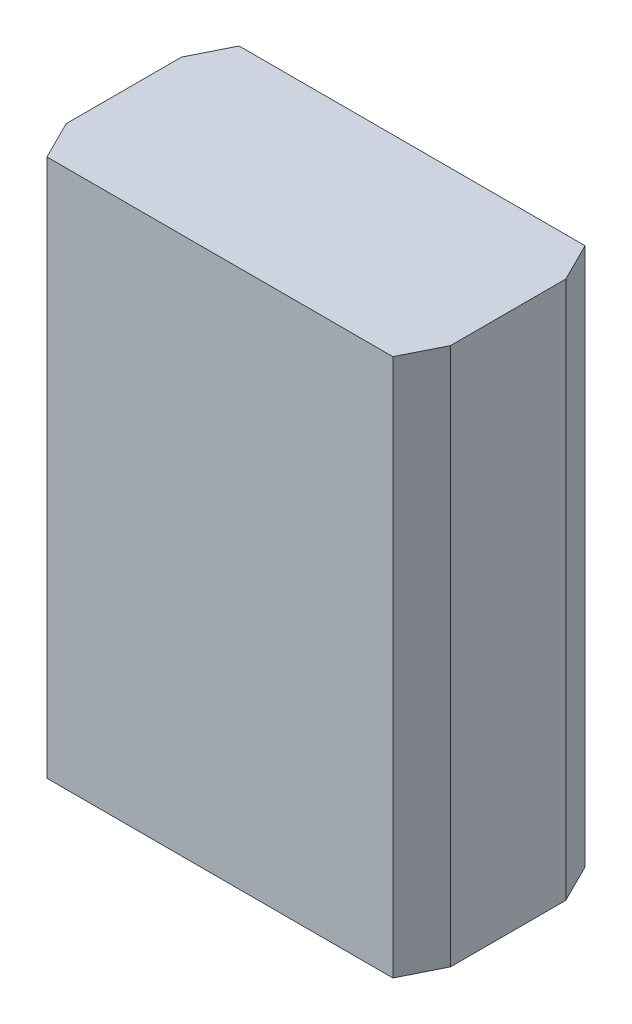
ISO-10303-21;
HEADER;
FILE_DESCRIPTION(('STEP AP214'),'2;1');
FILE_NAME('part.step','',(''),(''),'','','');
FILE_SCHEMA(('AUTOMOTIVE_DESIGN { 1 0 10303 214 1 1 1 1 }'));
ENDSEC;
DATA;
#1=APPLICATION_CONTEXT('core data for automotive mechanical design processes');
#2=APPLICATION_PROTOCOL_DEFINITION('international standard','automotive_design',2000,#1);
#3=PRODUCT_CONTEXT('',#1,'mechanical');
#4=PRODUCT('Part','Part','',(#3));
#5=PRODUCT_RELATED_PRODUCT_CATEGORY('part','',(#4));
#6=PRODUCT_DEFINITION_FORMATION('','',#4);
#7=PRODUCT_DEFINITION_CONTEXT('part definition',#1,'design');
#8=PRODUCT_DEFINITION('design','',#6,#7);
#9=PRODUCT_DEFINITION_SHAPE('','',#8);
#10=(LENGTH_UNIT() NAMED_UNIT(*) SI_UNIT(.MILLI.,.METRE.));
#11=(NAMED_UNIT(*) PLANE_ANGLE_UNIT() SI_UNIT($,.RADIAN.));
#12=(NAMED_UNIT(*) SI_UNIT($,.STERADIAN.) SOLID_ANGLE_UNIT());
#13=UNCERTAINTY_MEASURE_WITH_UNIT(LENGTH_MEASURE(1.E-05),#10,'distance_accuracy_value','');
#14=(GEOMETRIC_REPRESENTATION_CONTEXT(3) GLOBAL_UNCERTAINTY_ASSIGNED_CONTEXT((#13)) GLOBAL_UNIT_ASSIGNED_CONTEXT((#10,
#11,#12)) REPRESENTATION_CONTEXT('',''));
#15=CARTESIAN_POINT('',(0.,0.,0.));
#16=DIRECTION('',(0.,0.,1.));
#17=DIRECTION('',(1.,0.,0.));
#18=AXIS2_PLACEMENT_3D('',#15,#16,#17);
#19=CARTESIAN_POINT('',(0.,0.,0.));
#20=DIRECTION('',(0.,-1.,0.));
#21=DIRECTION('',(0.,0.,-1.));
#22=AXIS2_PLACEMENT_3D('',#19,#20,#21);
#23=PLANE('',#22);
#24=DIRECTION('',(0.,0.,1.));
#25=VECTOR('',#24,1.);
#26=CARTESIAN_POINT('',(-0.95,0.,-0.95));
#27=LINE('',#26,#25);
#28=CARTESIAN_POINT('',(-0.95,0.,-1.59));
#29=VERTEX_POINT('',#28);
#30=CARTESIAN_POINT('',(-0.95,0.,-0.95));
#31=VERTEX_POINT('',#30);
#32=EDGE_CURVE('E52',#29,#31,#27,.T.);
#33=ORIENTED_EDGE('',*,*,#32,.F.);
#34=DIRECTION('',(1.,0.,0.));
#35=VECTOR('',#34,1.);
#36=CARTESIAN_POINT('',(-0.95,0.,-1.59));
#37=LINE('',#36,#35);
#38=CARTESIAN_POINT('',(-1.59,0.,-1.59));
#39=VERTEX_POINT('',#38);
#40=EDGE_CURVE('E157',#39,#29,#37,.T.);
#41=ORIENTED_EDGE('',*,*,#40,.F.);
#42=DIRECTION('',(0.,0.,-1.));
#43=VECTOR('',#42,1.);
#44=CARTESIAN_POINT('',(-1.59,0.,-0.95));
#45=LINE('',#44,#43);
#46=CARTESIAN_POINT('',(-1.59,0.,-0.95));
#47=VERTEX_POINT('',#46);
#48=EDGE_CURVE('E180',#47,#39,#45,.T.);
#49=ORIENTED_EDGE('',*,*,#48,.F.);
#50=DIRECTION('',(-1.,0.,0.));
#51=VECTOR('',#50,1.);
#52=CARTESIAN_POINT('',(-0.95,0.,-0.95));
#53=LINE('',#52,#51);
#54=EDGE_CURVE('E168',#31,#47,#53,.T.);
#55=ORIENTED_EDGE('',*,*,#54,.F.);
#56=EDGE_LOOP('',(#33,#41,#49,#55));
#57=FACE_BOUND('',#56,.T.);
#58=DIRECTION('',(0.447213595499958,0.,0.894427190999916));
#59=VECTOR('',#58,1.);
#60=CARTESIAN_POINT('',(-2.286,0.,0.));
#61=LINE('',#60,#59);
#62=CARTESIAN_POINT('',(-2.54,0.,-0.508));
#63=VERTEX_POINT('',#62);
#64=CARTESIAN_POINT('',(-2.286,0.,0.));
#65=VERTEX_POINT('',#64);
#66=EDGE_CURVE('E158',#63,#65,#61,.T.);
#67=ORIENTED_EDGE('',*,*,#66,.F.);
#68=DIRECTION('',(0.,0.,-1.));
#69=VECTOR('',#68,1.);
#70=CARTESIAN_POINT('',(-2.54,0.,0.));
#71=LINE('',#70,#69);
#72=CARTESIAN_POINT('',(-2.54,0.,-2.032));
#73=VERTEX_POINT('',#72);
#74=EDGE_CURVE('E199',#63,#73,#71,.T.);
#75=ORIENTED_EDGE('',*,*,#74,.T.);
#76=DIRECTION('',(-0.447213595499958,0.,0.894427190999916));
#77=VECTOR('',#76,1.);
#78=CARTESIAN_POINT('',(-2.286,0.,-2.54));
#79=LINE('',#78,#77);
#80=CARTESIAN_POINT('',(-2.286,0.,-2.54));
#81=VERTEX_POINT('',#80);
#82=EDGE_CURVE('E196',#81,#73,#79,.T.);
#83=ORIENTED_EDGE('',*,*,#82,.F.);
#84=DIRECTION('',(-1.,0.,0.));
#85=VECTOR('',#84,1.);
#86=CARTESIAN_POINT('',(0.,0.,-2.54));
#87=LINE('',#86,#85);
#88=CARTESIAN_POINT('',(2.286,0.,-2.54));
#89=VERTEX_POINT('',#88);
#90=EDGE_CURVE('E39',#89,#81,#87,.T.);
#91=ORIENTED_EDGE('',*,*,#90,.F.);
#92=DIRECTION('',(0.447213595499958,0.,0.894427190999916));
#93=VECTOR('',#92,1.);
#94=CARTESIAN_POINT('',(2.286,0.,-2.54));
#95=LINE('',#94,#93);
#96=CARTESIAN_POINT('',(2.54,0.,-2.032));
#97=VERTEX_POINT('',#96);
#98=EDGE_CURVE('E245',#89,#97,#95,.T.);
#99=ORIENTED_EDGE('',*,*,#98,.T.);
#100=DIRECTION('',(0.,0.,-1.));
#101=VECTOR('',#100,1.);
#102=CARTESIAN_POINT('',(2.54,0.,0.));
#103=LINE('',#102,#101);
#104=CARTESIAN_POINT('',(2.54,0.,-0.508));
#105=VERTEX_POINT('',#104);
#106=EDGE_CURVE('E269',#105,#97,#103,.T.);
#107=ORIENTED_EDGE('',*,*,#106,.F.);
#108=DIRECTION('',(-0.447213595499958,0.,0.894427190999916));
#109=VECTOR('',#108,1.);
#110=CARTESIAN_POINT('',(2.286,0.,0.));
#111=LINE('',#110,#109);
#112=CARTESIAN_POINT('',(2.286,0.,0.));
#113=VERTEX_POINT('',#112);
#114=EDGE_CURVE('E241',#105,#113,#111,.T.);
#115=ORIENTED_EDGE('',*,*,#114,.T.);
#116=DIRECTION('',(1.,0.,0.));
#117=VECTOR('',#116,1.);
#118=CARTESIAN_POINT('',(0.,0.,0.));
#119=LINE('',#118,#117);
#120=EDGE_CURVE('E265',#65,#113,#119,.T.);
#121=ORIENTED_EDGE('',*,*,#120,.F.);
#122=EDGE_LOOP('',(#67,#75,#83,#91,#99,#107,#115,#121));
#123=FACE_BOUND('',#122,.T.);
#124=DIRECTION('',(-1.,0.,0.));
#125=VECTOR('',#124,1.);
#126=CARTESIAN_POINT('',(0.95,0.,-1.59));
#127=LINE('',#126,#125);
#128=CARTESIAN_POINT('',(1.59,0.,-1.59));
#129=VERTEX_POINT('',#128);
#130=CARTESIAN_POINT('',(0.95,0.,-1.59));
#131=VERTEX_POINT('',#130);
#132=EDGE_CURVE('E215',#129,#131,#127,.T.);
#133=ORIENTED_EDGE('',*,*,#132,.T.);
#134=DIRECTION('',(0.,0.,1.));
#135=VECTOR('',#134,1.);
#136=CARTESIAN_POINT('',(0.95,0.,-0.95));
#137=LINE('',#136,#135);
#138=CARTESIAN_POINT('',(0.95,0.,-0.95));
#139=VERTEX_POINT('',#138);
#140=EDGE_CURVE('E209',#131,#139,#137,.T.);
#141=ORIENTED_EDGE('',*,*,#140,.T.);
#142=DIRECTION('',(1.,0.,0.));
#143=VECTOR('',#142,1.);
#144=CARTESIAN_POINT('',(0.95,0.,-0.95));
#145=LINE('',#144,#143);
#146=CARTESIAN_POINT('',(1.59,0.,-0.95));
#147=VERTEX_POINT('',#146);
#148=EDGE_CURVE('E224',#139,#147,#145,.T.);
#149=ORIENTED_EDGE('',*,*,#148,.T.);
#150=DIRECTION('',(0.,0.,-1.));
#151=VECTOR('',#150,1.);
#152=CARTESIAN_POINT('',(1.59,0.,-0.95));
#153=LINE('',#152,#151);
#154=EDGE_CURVE('E227',#147,#129,#153,.T.);
#155=ORIENTED_EDGE('',*,*,#154,.T.);
#156=EDGE_LOOP('',(#133,#141,#149,#155));
#157=FACE_BOUND('',#156,.T.);
#158=ADVANCED_FACE('F35',(#57,#123,#157),#23,.T.);
#159=CARTESIAN_POINT('',(2.54,7.112,0.));
#160=DIRECTION('',(-1.,0.,0.));
#161=DIRECTION('',(0.,0.,1.));
#162=AXIS2_PLACEMENT_3D('',#159,#160,#161);
#163=PLANE('',#162);
#164=DIRECTION('',(0.,-1.,0.));
#165=VECTOR('',#164,1.);
#166=CARTESIAN_POINT('',(2.54,7.67996126628495,-0.508));
#167=LINE('',#166,#165);
#168=CARTESIAN_POINT('',(2.54,7.112,-0.508));
#169=VERTEX_POINT('',#168);
#170=EDGE_CURVE('E246',#169,#105,#167,.T.);
#171=ORIENTED_EDGE('',*,*,#170,.T.);
#172=ORIENTED_EDGE('',*,*,#106,.T.);
#173=DIRECTION('',(0.,-1.,0.));
#174=VECTOR('',#173,1.);
#175=CARTESIAN_POINT('',(2.54,7.67996126628495,-2.032));
#176=LINE('',#175,#174);
#177=CARTESIAN_POINT('',(2.54,7.112,-2.032));
#178=VERTEX_POINT('',#177);
#179=EDGE_CURVE('E256',#178,#97,#176,.T.);
#180=ORIENTED_EDGE('',*,*,#179,.F.);
#181=DIRECTION('',(0.,0.,-1.));
#182=VECTOR('',#181,1.);
#183=CARTESIAN_POINT('',(2.54,7.112,0.));
#184=LINE('',#183,#182);
#185=EDGE_CURVE('E44',#169,#178,#184,.T.);
#186=ORIENTED_EDGE('',*,*,#185,.F.);
#187=EDGE_LOOP('',(#171,#172,#180,#186));
#188=FACE_BOUND('',#187,.T.);
#189=ADVANCED_FACE('F298',(#188),#163,.F.);
#190=CARTESIAN_POINT('',(0.,7.112,0.));
#191=DIRECTION('',(0.,-1.,0.));
#192=DIRECTION('',(0.,0.,-1.));
#193=AXIS2_PLACEMENT_3D('',#190,#191,#192);
#194=PLANE('',#193);
#195=DIRECTION('',(0.,0.,-1.));
#196=VECTOR('',#195,1.);
#197=CARTESIAN_POINT('',(-2.54,7.112,0.));
#198=LINE('',#197,#196);
#199=CARTESIAN_POINT('',(-2.54,7.112,-0.508));
#200=VERTEX_POINT('',#199);
#201=CARTESIAN_POINT('',(-2.54,7.112,-2.032));
#202=VERTEX_POINT('',#201);
#203=EDGE_CURVE('E207',#200,#202,#198,.T.);
#204=ORIENTED_EDGE('',*,*,#203,.F.);
#205=DIRECTION('',(-0.447213595499958,0.,-0.894427190999916));
#206=VECTOR('',#205,1.);
#207=CARTESIAN_POINT('',(-2.286,7.112,0.));
#208=LINE('',#207,#206);
#209=CARTESIAN_POINT('',(-2.286,7.112,0.));
#210=VERTEX_POINT('',#209);
#211=EDGE_CURVE('E60',#210,#200,#208,.T.);
#212=ORIENTED_EDGE('',*,*,#211,.F.);
#213=DIRECTION('',(1.,0.,0.));
#214=VECTOR('',#213,1.);
#215=CARTESIAN_POINT('',(0.,7.112,0.));
#216=LINE('',#215,#214);
#217=CARTESIAN_POINT('',(2.286,7.112,0.));
#218=VERTEX_POINT('',#217);
#219=EDGE_CURVE('E266',#210,#218,#216,.T.);
#220=ORIENTED_EDGE('',*,*,#219,.T.);
#221=DIRECTION('',(0.447213595499958,0.,-0.894427190999916));
#222=VECTOR('',#221,1.);
#223=CARTESIAN_POINT('',(2.286,7.112,0.));
#224=LINE('',#223,#222);
#225=EDGE_CURVE('E242',#218,#169,#224,.T.);
#226=ORIENTED_EDGE('',*,*,#225,.T.);
#227=ORIENTED_EDGE('',*,*,#185,.T.);
#228=DIRECTION('',(-0.447213595499958,0.,-0.894427190999916));
#229=VECTOR('',#228,1.);
#230=CARTESIAN_POINT('',(2.286,7.112,-2.54));
#231=LINE('',#230,#229);
#232=CARTESIAN_POINT('',(2.286,7.112,-2.54));
#233=VERTEX_POINT('',#232);
#234=EDGE_CURVE('E262',#178,#233,#231,.T.);
#235=ORIENTED_EDGE('',*,*,#234,.T.);
#236=DIRECTION('',(-1.,0.,0.));
#237=VECTOR('',#236,1.);
#238=CARTESIAN_POINT('',(0.,7.112,-2.54));
#239=LINE('',#238,#237);
#240=CARTESIAN_POINT('',(-2.286,7.112,-2.54));
#241=VERTEX_POINT('',#240);
#242=EDGE_CURVE('E11',#233,#241,#239,.T.);
#243=ORIENTED_EDGE('',*,*,#242,.T.);
#244=DIRECTION('',(0.447213595499958,0.,-0.894427190999916));
#245=VECTOR('',#244,1.);
#246=CARTESIAN_POINT('',(-2.286,7.112,-2.54));
#247=LINE('',#246,#245);
#248=EDGE_CURVE('E197',#202,#241,#247,.T.);
#249=ORIENTED_EDGE('',*,*,#248,.F.);
#250=EDGE_LOOP('',(#204,#212,#220,#226,#227,#235,#243,#249));
#251=FACE_BOUND('',#250,.T.);
#252=ADVANCED_FACE('F292',(#251),#194,.F.);
#253=CARTESIAN_POINT('',(0.,7.112,0.));
#254=DIRECTION('',(0.,0.,-1.));
#255=DIRECTION('',(-1.,0.,0.));
#256=AXIS2_PLACEMENT_3D('',#253,#254,#255);
#257=PLANE('',#256);
#258=ORIENTED_EDGE('',*,*,#219,.F.);
#259=DIRECTION('',(0.,-1.,0.));
#260=VECTOR('',#259,1.);
#261=CARTESIAN_POINT('',(-2.286,7.67996126628495,0.));
#262=LINE('',#261,#260);
#263=EDGE_CURVE('E192',#210,#65,#262,.T.);
#264=ORIENTED_EDGE('',*,*,#263,.T.);
#265=ORIENTED_EDGE('',*,*,#120,.T.);
#266=DIRECTION('',(0.,-1.,0.));
#267=VECTOR('',#266,1.);
#268=CARTESIAN_POINT('',(2.286,7.67996126628495,0.));
#269=LINE('',#268,#267);
#270=EDGE_CURVE('E249',#218,#113,#269,.T.);
#271=ORIENTED_EDGE('',*,*,#270,.F.);
#272=EDGE_LOOP('',(#258,#264,#265,#271));
#273=FACE_BOUND('',#272,.T.);
#274=ADVANCED_FACE('F37',(#273),#257,.F.);
#275=CARTESIAN_POINT('',(0.,7.112,-2.54));
#276=DIRECTION('',(0.,0.,1.));
#277=DIRECTION('',(1.,0.,0.));
#278=AXIS2_PLACEMENT_3D('',#275,#276,#277);
#279=PLANE('',#278);
#280=ORIENTED_EDGE('',*,*,#90,.T.);
#281=DIRECTION('',(0.,-1.,0.));
#282=VECTOR('',#281,1.);
#283=CARTESIAN_POINT('',(-2.286,7.67996126628495,-2.54));
#284=LINE('',#283,#282);
#285=EDGE_CURVE('E203',#241,#81,#284,.T.);
#286=ORIENTED_EDGE('',*,*,#285,.F.);
#287=ORIENTED_EDGE('',*,*,#242,.F.);
#288=DIRECTION('',(0.,-1.,0.));
#289=VECTOR('',#288,1.);
#290=CARTESIAN_POINT('',(2.286,7.67996126628495,-2.54));
#291=LINE('',#290,#289);
#292=EDGE_CURVE('E259',#233,#89,#291,.T.);
#293=ORIENTED_EDGE('',*,*,#292,.T.);
#294=EDGE_LOOP('',(#280,#286,#287,#293));
#295=FACE_BOUND('',#294,.T.);
#296=ADVANCED_FACE('F277',(#295),#279,.F.);
#297=CARTESIAN_POINT('',(2.286,7.67996126628495,-2.54));
#298=DIRECTION('',(0.894427190999916,0.,-0.447213595499958));
#299=DIRECTION('',(-0.447213595499958,0.,-0.894427190999916));
#300=AXIS2_PLACEMENT_3D('',#297,#298,#299);
#301=PLANE('',#300);
#302=ORIENTED_EDGE('',*,*,#179,.T.);
#303=ORIENTED_EDGE('',*,*,#98,.F.);
#304=ORIENTED_EDGE('',*,*,#292,.F.);
#305=ORIENTED_EDGE('',*,*,#234,.F.);
#306=EDGE_LOOP('',(#302,#303,#304,#305));
#307=FACE_BOUND('',#306,.T.);
#308=ADVANCED_FACE('F297',(#307),#301,.T.);
#309=CARTESIAN_POINT('',(2.286,7.67996126628495,0.));
#310=DIRECTION('',(0.894427190999916,0.,0.447213595499958));
#311=DIRECTION('',(0.447213595499958,0.,-0.894427190999916));
#312=AXIS2_PLACEMENT_3D('',#309,#310,#311);
#313=PLANE('',#312);
#314=ORIENTED_EDGE('',*,*,#270,.T.);
#315=ORIENTED_EDGE('',*,*,#114,.F.);
#316=ORIENTED_EDGE('',*,*,#170,.F.);
#317=ORIENTED_EDGE('',*,*,#225,.F.);
#318=EDGE_LOOP('',(#314,#315,#316,#317));
#319=FACE_BOUND('',#318,.T.);
#320=ADVANCED_FACE('F302',(#319),#313,.T.);
#321=CARTESIAN_POINT('',(0.95,6.35,-0.95));
#322=DIRECTION('',(1.,0.,0.));
#323=DIRECTION('',(0.,0.,-1.));
#324=AXIS2_PLACEMENT_3D('',#321,#322,#323);
#325=PLANE('',#324);
#326=ORIENTED_EDGE('',*,*,#140,.F.);
#327=DIRECTION('',(0.,-1.,0.));
#328=VECTOR('',#327,1.);
#329=CARTESIAN_POINT('',(0.95,6.35,-1.59));
#330=LINE('',#329,#328);
#331=CARTESIAN_POINT('',(0.95,6.35,-1.59));
#332=VERTEX_POINT('',#331);
#333=EDGE_CURVE('E221',#332,#131,#330,.T.);
#334=ORIENTED_EDGE('',*,*,#333,.F.);
#335=DIRECTION('',(0.,0.,1.));
#336=VECTOR('',#335,1.);
#337=CARTESIAN_POINT('',(0.95,6.35,-0.95));
#338=LINE('',#337,#336);
#339=CARTESIAN_POINT('',(0.95,6.35,-0.95));
#340=VERTEX_POINT('',#339);
#341=EDGE_CURVE('E211',#332,#340,#338,.T.);
#342=ORIENTED_EDGE('',*,*,#341,.T.);
#343=DIRECTION('',(0.,-1.,0.));
#344=VECTOR('',#343,1.);
#345=CARTESIAN_POINT('',(0.95,6.35,-0.95));
#346=LINE('',#345,#344);
#347=EDGE_CURVE('E238',#340,#139,#346,.T.);
#348=ORIENTED_EDGE('',*,*,#347,.T.);
#349=EDGE_LOOP('',(#326,#334,#342,#348));
#350=FACE_BOUND('',#349,.T.);
#351=ADVANCED_FACE('F353',(#350),#325,.T.);
#352=CARTESIAN_POINT('',(0.95,6.35,-0.95));
#353=DIRECTION('',(0.,0.,-1.));
#354=DIRECTION('',(-1.,0.,0.));
#355=AXIS2_PLACEMENT_3D('',#352,#353,#354);
#356=PLANE('',#355);
#357=ORIENTED_EDGE('',*,*,#148,.F.);
#358=ORIENTED_EDGE('',*,*,#347,.F.);
#359=DIRECTION('',(1.,0.,0.));
#360=VECTOR('',#359,1.);
#361=CARTESIAN_POINT('',(0.95,6.35,-0.95));
#362=LINE('',#361,#360);
#363=CARTESIAN_POINT('',(1.59,6.35,-0.95));
#364=VERTEX_POINT('',#363);
#365=EDGE_CURVE('E214',#340,#364,#362,.T.);
#366=ORIENTED_EDGE('',*,*,#365,.T.);
#367=DIRECTION('',(0.,-1.,0.));
#368=VECTOR('',#367,1.);
#369=CARTESIAN_POINT('',(1.59,6.35,-0.95));
#370=LINE('',#369,#368);
#371=EDGE_CURVE('E236',#364,#147,#370,.T.);
#372=ORIENTED_EDGE('',*,*,#371,.T.);
#373=EDGE_LOOP('',(#357,#358,#366,#372));
#374=FACE_BOUND('',#373,.T.);
#375=ADVANCED_FACE('F363',(#374),#356,.T.);
#376=CARTESIAN_POINT('',(1.59,6.35,-0.95));
#377=DIRECTION('',(-1.,0.,0.));
#378=DIRECTION('',(0.,0.,1.));
#379=AXIS2_PLACEMENT_3D('',#376,#377,#378);
#380=PLANE('',#379);
#381=ORIENTED_EDGE('',*,*,#154,.F.);
#382=ORIENTED_EDGE('',*,*,#371,.F.);
#383=DIRECTION('',(0.,0.,-1.));
#384=VECTOR('',#383,1.);
#385=CARTESIAN_POINT('',(1.59,6.35,-0.95));
#386=LINE('',#385,#384);
#387=CARTESIAN_POINT('',(1.59,6.35,-1.59));
#388=VERTEX_POINT('',#387);
#389=EDGE_CURVE('E217',#364,#388,#386,.T.);
#390=ORIENTED_EDGE('',*,*,#389,.T.);
#391=DIRECTION('',(0.,-1.,0.));
#392=VECTOR('',#391,1.);
#393=CARTESIAN_POINT('',(1.59,6.35,-1.59));
#394=LINE('',#393,#392);
#395=EDGE_CURVE('E234',#388,#129,#394,.T.);
#396=ORIENTED_EDGE('',*,*,#395,.T.);
#397=EDGE_LOOP('',(#381,#382,#390,#396));
#398=FACE_BOUND('',#397,.T.);
#399=ADVANCED_FACE('F373',(#398),#380,.T.);
#400=CARTESIAN_POINT('',(0.95,6.35,-1.59));
#401=DIRECTION('',(0.,0.,1.));
#402=DIRECTION('',(1.,0.,0.));
#403=AXIS2_PLACEMENT_3D('',#400,#401,#402);
#404=PLANE('',#403);
#405=ORIENTED_EDGE('',*,*,#132,.F.);
#406=ORIENTED_EDGE('',*,*,#395,.F.);
#407=DIRECTION('',(-1.,0.,0.));
#408=VECTOR('',#407,1.);
#409=CARTESIAN_POINT('',(0.95,6.35,-1.59));
#410=LINE('',#409,#408);
#411=EDGE_CURVE('E219',#388,#332,#410,.T.);
#412=ORIENTED_EDGE('',*,*,#411,.T.);
#413=ORIENTED_EDGE('',*,*,#333,.T.);
#414=EDGE_LOOP('',(#405,#406,#412,#413));
#415=FACE_BOUND('',#414,.T.);
#416=ADVANCED_FACE('F383',(#415),#404,.T.);
#417=CARTESIAN_POINT('',(0.,6.35,0.));
#418=DIRECTION('',(0.,-1.,0.));
#419=DIRECTION('',(0.,0.,-1.));
#420=AXIS2_PLACEMENT_3D('',#417,#418,#419);
#421=PLANE('',#420);
#422=ORIENTED_EDGE('',*,*,#341,.F.);
#423=ORIENTED_EDGE('',*,*,#411,.F.);
#424=ORIENTED_EDGE('',*,*,#389,.F.);
#425=ORIENTED_EDGE('',*,*,#365,.F.);
#426=EDGE_LOOP('',(#422,#423,#424,#425));
#427=FACE_BOUND('',#426,.T.);
#428=ADVANCED_FACE('F393',(#427),#421,.T.);
#429=CARTESIAN_POINT('',(-2.54,7.112,0.));
#430=DIRECTION('',(-1.,0.,0.));
#431=DIRECTION('',(0.,0.,1.));
#432=AXIS2_PLACEMENT_3D('',#429,#430,#431);
#433=PLANE('',#432);
#434=DIRECTION('',(0.,-1.,0.));
#435=VECTOR('',#434,1.);
#436=CARTESIAN_POINT('',(-2.54,7.67996126628495,-0.508));
#437=LINE('',#436,#435);
#438=EDGE_CURVE('E190',#200,#63,#437,.T.);
#439=ORIENTED_EDGE('',*,*,#438,.F.);
#440=ORIENTED_EDGE('',*,*,#203,.T.);
#441=DIRECTION('',(0.,-1.,0.));
#442=VECTOR('',#441,1.);
#443=CARTESIAN_POINT('',(-2.54,7.67996126628495,-2.032));
#444=LINE('',#443,#442);
#445=EDGE_CURVE('E200',#202,#73,#444,.T.);
#446=ORIENTED_EDGE('',*,*,#445,.T.);
#447=ORIENTED_EDGE('',*,*,#74,.F.);
#448=EDGE_LOOP('',(#439,#440,#446,#447));
#449=FACE_BOUND('',#448,.T.);
#450=ADVANCED_FACE('F289',(#449),#433,.T.);
#451=CARTESIAN_POINT('',(-2.286,7.67996126628495,-2.54));
#452=DIRECTION('',(0.894427190999916,0.,0.447213595499958));
#453=DIRECTION('',(0.447213595499958,0.,-0.894427190999916));
#454=AXIS2_PLACEMENT_3D('',#451,#452,#453);
#455=PLANE('',#454);
#456=ORIENTED_EDGE('',*,*,#248,.T.);
#457=ORIENTED_EDGE('',*,*,#285,.T.);
#458=ORIENTED_EDGE('',*,*,#82,.T.);
#459=ORIENTED_EDGE('',*,*,#445,.F.);
#460=EDGE_LOOP('',(#456,#457,#458,#459));
#461=FACE_BOUND('',#460,.T.);
#462=ADVANCED_FACE('F286',(#461),#455,.F.);
#463=CARTESIAN_POINT('',(-2.286,7.67996126628495,0.));
#464=DIRECTION('',(0.894427190999916,0.,-0.447213595499958));
#465=DIRECTION('',(-0.447213595499958,0.,-0.894427190999916));
#466=AXIS2_PLACEMENT_3D('',#463,#464,#465);
#467=PLANE('',#466);
#468=ORIENTED_EDGE('',*,*,#211,.T.);
#469=ORIENTED_EDGE('',*,*,#438,.T.);
#470=ORIENTED_EDGE('',*,*,#66,.T.);
#471=ORIENTED_EDGE('',*,*,#263,.F.);
#472=EDGE_LOOP('',(#468,#469,#470,#471));
#473=FACE_BOUND('',#472,.T.);
#474=ADVANCED_FACE('F305',(#473),#467,.F.);
#475=CARTESIAN_POINT('',(-0.95,6.35,-0.95));
#476=DIRECTION('',(1.,0.,0.));
#477=DIRECTION('',(0.,0.,-1.));
#478=AXIS2_PLACEMENT_3D('',#475,#476,#477);
#479=PLANE('',#478);
#480=ORIENTED_EDGE('',*,*,#32,.T.);
#481=DIRECTION('',(0.,-1.,0.));
#482=VECTOR('',#481,1.);
#483=CARTESIAN_POINT('',(-0.95,6.35,-0.95));
#484=LINE('',#483,#482);
#485=CARTESIAN_POINT('',(-0.95,6.35,-0.95));
#486=VERTEX_POINT('',#485);
#487=EDGE_CURVE('E164',#486,#31,#484,.T.);
#488=ORIENTED_EDGE('',*,*,#487,.F.);
#489=DIRECTION('',(0.,0.,1.));
#490=VECTOR('',#489,1.);
#491=CARTESIAN_POINT('',(-0.95,6.35,-0.95));
#492=LINE('',#491,#490);
#493=CARTESIAN_POINT('',(-0.95,6.35,-1.59));
#494=VERTEX_POINT('',#493);
#495=EDGE_CURVE('E162',#494,#486,#492,.T.);
#496=ORIENTED_EDGE('',*,*,#495,.F.);
#497=DIRECTION('',(0.,-1.,0.));
#498=VECTOR('',#497,1.);
#499=CARTESIAN_POINT('',(-0.95,6.35,-1.59));
#500=LINE('',#499,#498);
#501=EDGE_CURVE('E150',#494,#29,#500,.T.);
#502=ORIENTED_EDGE('',*,*,#501,.T.);
#503=EDGE_LOOP('',(#480,#488,#496,#502));
#504=FACE_BOUND('',#503,.T.);
#505=ADVANCED_FACE('F163',(#504),#479,.F.);
#506=CARTESIAN_POINT('',(-0.95,6.35,-1.59));
#507=DIRECTION('',(0.,0.,-1.));
#508=DIRECTION('',(-1.,0.,0.));
#509=AXIS2_PLACEMENT_3D('',#506,#507,#508);
#510=PLANE('',#509);
#511=ORIENTED_EDGE('',*,*,#40,.T.);
#512=ORIENTED_EDGE('',*,*,#501,.F.);
#513=DIRECTION('',(1.,0.,0.));
#514=VECTOR('',#513,1.);
#515=CARTESIAN_POINT('',(-0.95,6.35,-1.59));
#516=LINE('',#515,#514);
#517=CARTESIAN_POINT('',(-1.59,6.35,-1.59));
#518=VERTEX_POINT('',#517);
#519=EDGE_CURVE('E154',#518,#494,#516,.T.);
#520=ORIENTED_EDGE('',*,*,#519,.F.);
#521=DIRECTION('',(0.,-1.,0.));
#522=VECTOR('',#521,1.);
#523=CARTESIAN_POINT('',(-1.59,6.35,-1.59));
#524=LINE('',#523,#522);
#525=EDGE_CURVE('E159',#518,#39,#524,.T.);
#526=ORIENTED_EDGE('',*,*,#525,.T.);
#527=EDGE_LOOP('',(#511,#512,#520,#526));
#528=FACE_BOUND('',#527,.T.);
#529=ADVANCED_FACE('F152',(#528),#510,.F.);
#530=CARTESIAN_POINT('',(-1.59,6.35,-0.95));
#531=DIRECTION('',(-1.,0.,0.));
#532=DIRECTION('',(0.,0.,1.));
#533=AXIS2_PLACEMENT_3D('',#530,#531,#532);
#534=PLANE('',#533);
#535=ORIENTED_EDGE('',*,*,#48,.T.);
#536=ORIENTED_EDGE('',*,*,#525,.F.);
#537=DIRECTION('',(0.,0.,-1.));
#538=VECTOR('',#537,1.);
#539=CARTESIAN_POINT('',(-1.59,6.35,-0.95));
#540=LINE('',#539,#538);
#541=CARTESIAN_POINT('',(-1.59,6.35,-0.95));
#542=VERTEX_POINT('',#541);
#543=EDGE_CURVE('E172',#542,#518,#540,.T.);
#544=ORIENTED_EDGE('',*,*,#543,.F.);
#545=DIRECTION('',(0.,-1.,0.));
#546=VECTOR('',#545,1.);
#547=CARTESIAN_POINT('',(-1.59,6.35,-0.95));
#548=LINE('',#547,#546);
#549=EDGE_CURVE('E186',#542,#47,#548,.T.);
#550=ORIENTED_EDGE('',*,*,#549,.T.);
#551=EDGE_LOOP('',(#535,#536,#544,#550));
#552=FACE_BOUND('',#551,.T.);
#553=ADVANCED_FACE('F459',(#552),#534,.F.);
#554=CARTESIAN_POINT('',(-0.95,6.35,-0.95));
#555=DIRECTION('',(0.,0.,1.));
#556=DIRECTION('',(1.,0.,0.));
#557=AXIS2_PLACEMENT_3D('',#554,#555,#556);
#558=PLANE('',#557);
#559=ORIENTED_EDGE('',*,*,#54,.T.);
#560=ORIENTED_EDGE('',*,*,#549,.F.);
#561=DIRECTION('',(-1.,0.,0.));
#562=VECTOR('',#561,1.);
#563=CARTESIAN_POINT('',(-0.95,6.35,-0.95));
#564=LINE('',#563,#562);
#565=EDGE_CURVE('E174',#486,#542,#564,.T.);
#566=ORIENTED_EDGE('',*,*,#565,.F.);
#567=ORIENTED_EDGE('',*,*,#487,.T.);
#568=EDGE_LOOP('',(#559,#560,#566,#567));
#569=FACE_BOUND('',#568,.T.);
#570=ADVANCED_FACE('F467',(#569),#558,.F.);
#571=CARTESIAN_POINT('',(0.,6.35,0.));
#572=DIRECTION('',(0.,-1.,0.));
#573=DIRECTION('',(0.,0.,-1.));
#574=AXIS2_PLACEMENT_3D('',#571,#572,#573);
#575=PLANE('',#574);
#576=ORIENTED_EDGE('',*,*,#495,.T.);
#577=ORIENTED_EDGE('',*,*,#565,.T.);
#578=ORIENTED_EDGE('',*,*,#543,.T.);
#579=ORIENTED_EDGE('',*,*,#519,.T.);
#580=EDGE_LOOP('',(#576,#577,#578,#579));
#581=FACE_BOUND('',#580,.T.);
#582=ADVANCED_FACE('F170',(#581),#575,.T.);
#583=CLOSED_SHELL('',(#158,#189,#252,#274,#296,#308,#320,#351,#375,#399,#416,#428,#450,#462,
#474,#505,#529,#553,#570,#582));
#584=MANIFOLD_SOLID_BREP('B2',#583);
#585=ADVANCED_BREP_SHAPE_REPRESENTATION('',(#18,#584),#14);
#586=SHAPE_DEFINITION_REPRESENTATION(#9,#585);
ENDSEC;
END-ISO-10303-21;
